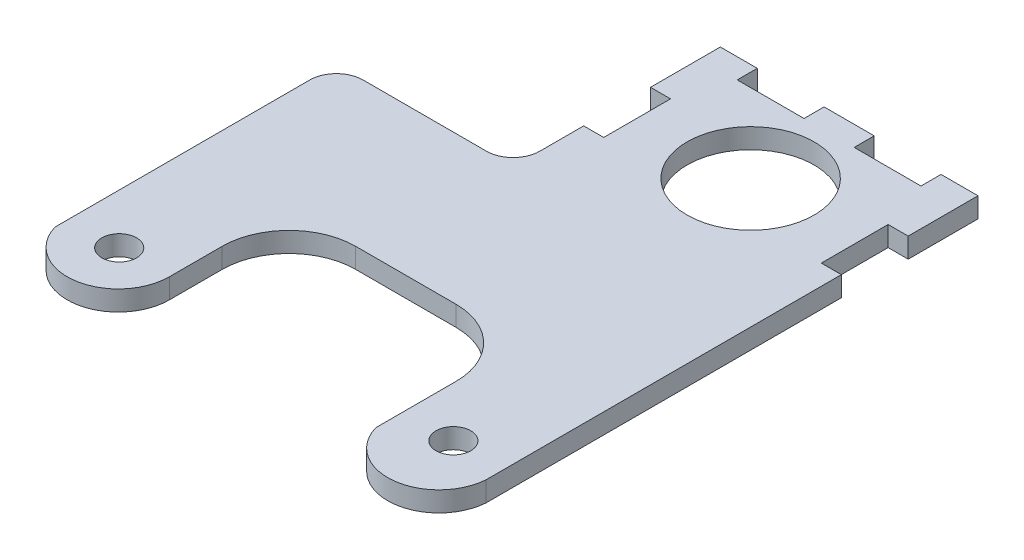
ISO-10303-21;
HEADER;
FILE_DESCRIPTION(('STEP AP214'),'2;1');
FILE_NAME('part.step','',(''),(''),'','','');
FILE_SCHEMA(('AUTOMOTIVE_DESIGN { 1 0 10303 214 1 1 1 1 }'));
ENDSEC;
DATA;
#1=APPLICATION_CONTEXT('core data for automotive mechanical design processes');
#2=APPLICATION_PROTOCOL_DEFINITION('international standard','automotive_design',2000,#1);
#3=PRODUCT_CONTEXT('',#1,'mechanical');
#4=PRODUCT('Part','Part','',(#3));
#5=PRODUCT_RELATED_PRODUCT_CATEGORY('part','',(#4));
#6=PRODUCT_DEFINITION_FORMATION('','',#4);
#7=PRODUCT_DEFINITION_CONTEXT('part definition',#1,'design');
#8=PRODUCT_DEFINITION('design','',#6,#7);
#9=PRODUCT_DEFINITION_SHAPE('','',#8);
#10=(LENGTH_UNIT() NAMED_UNIT(*) SI_UNIT(.MILLI.,.METRE.));
#11=(NAMED_UNIT(*) PLANE_ANGLE_UNIT() SI_UNIT($,.RADIAN.));
#12=(NAMED_UNIT(*) SI_UNIT($,.STERADIAN.) SOLID_ANGLE_UNIT());
#13=UNCERTAINTY_MEASURE_WITH_UNIT(LENGTH_MEASURE(1.E-05),#10,'distance_accuracy_value','');
#14=(GEOMETRIC_REPRESENTATION_CONTEXT(3) GLOBAL_UNCERTAINTY_ASSIGNED_CONTEXT((#13)) GLOBAL_UNIT_ASSIGNED_CONTEXT((#10,
#11,#12)) REPRESENTATION_CONTEXT('',''));
#15=CARTESIAN_POINT('',(0.,0.,0.));
#16=DIRECTION('',(0.,0.,1.));
#17=DIRECTION('',(1.,0.,0.));
#18=AXIS2_PLACEMENT_3D('',#15,#16,#17);
#19=CARTESIAN_POINT('',(32.5,3.,0.));
#20=DIRECTION('',(-1.,0.,0.));
#21=DIRECTION('',(0.,0.,1.));
#22=AXIS2_PLACEMENT_3D('',#19,#20,#21);
#23=PLANE('',#22);
#24=DIRECTION('',(0.,0.,-1.));
#25=VECTOR('',#24,1.);
#26=CARTESIAN_POINT('',(32.5,0.,0.));
#27=LINE('',#26,#25);
#28=CARTESIAN_POINT('',(32.5,0.,34.9170982884143));
#29=VERTEX_POINT('',#28);
#30=CARTESIAN_POINT('',(32.5,0.,-18.2206257203415));
#31=VERTEX_POINT('',#30);
#32=EDGE_CURVE('E270',#29,#31,#27,.T.);
#33=ORIENTED_EDGE('',*,*,#32,.T.);
#34=DIRECTION('',(0.,1.,0.));
#35=VECTOR('',#34,1.);
#36=CARTESIAN_POINT('',(32.5,0.,-18.2206257203415));
#37=LINE('',#36,#35);
#38=CARTESIAN_POINT('',(32.5,3.,-18.2206257203415));
#39=VERTEX_POINT('',#38);
#40=EDGE_CURVE('E542',#31,#39,#37,.T.);
#41=ORIENTED_EDGE('',*,*,#40,.T.);
#42=DIRECTION('',(0.,0.,-1.));
#43=VECTOR('',#42,1.);
#44=CARTESIAN_POINT('',(32.5,3.,0.));
#45=LINE('',#44,#43);
#46=CARTESIAN_POINT('',(32.5,3.,34.9170982884143));
#47=VERTEX_POINT('',#46);
#48=EDGE_CURVE('E447',#47,#39,#45,.T.);
#49=ORIENTED_EDGE('',*,*,#48,.F.);
#50=DIRECTION('',(0.,-1.,0.));
#51=VECTOR('',#50,1.);
#52=CARTESIAN_POINT('',(32.5,3.,34.9170982884143));
#53=LINE('',#52,#51);
#54=EDGE_CURVE('E310',#47,#29,#53,.T.);
#55=ORIENTED_EDGE('',*,*,#54,.T.);
#56=EDGE_LOOP('',(#33,#41,#49,#55));
#57=FACE_BOUND('',#56,.T.);
#58=ADVANCED_FACE('F41',(#57),#23,.F.);
#59=CARTESIAN_POINT('',(-4.57649061620145E-12,3.,-38.6680841648914));
#60=DIRECTION('',(-1.1835317717542E-13,0.,-1.));
#61=DIRECTION('',(-1.,0.,1.1835317717542E-13));
#62=AXIS2_PLACEMENT_3D('',#59,#60,#61);
#63=PLANE('',#62);
#64=DIRECTION('',(0.,1.,0.));
#65=VECTOR('',#64,1.);
#66=CARTESIAN_POINT('',(26.9706856458377,0.,-38.6680841648953));
#67=LINE('',#66,#65);
#68=CARTESIAN_POINT('',(26.9706856458377,0.,-38.6680841648953));
#69=VERTEX_POINT('',#68);
#70=CARTESIAN_POINT('',(26.9706856458377,3.,-38.6680841648953));
#71=VERTEX_POINT('',#70);
#72=EDGE_CURVE('E516',#69,#71,#67,.T.);
#73=ORIENTED_EDGE('',*,*,#72,.T.);
#74=DIRECTION('',(1.,0.,-1.1835317717542E-13));
#75=VECTOR('',#74,1.);
#76=CARTESIAN_POINT('',(-4.57649061620145E-12,3.,-38.6680841648914));
#77=LINE('',#76,#75);
#78=CARTESIAN_POINT('',(32.5,3.,-38.6680841648953));
#79=VERTEX_POINT('',#78);
#80=EDGE_CURVE('E451',#71,#79,#77,.T.);
#81=ORIENTED_EDGE('',*,*,#80,.T.);
#82=DIRECTION('',(0.,-1.,0.));
#83=VECTOR('',#82,1.);
#84=CARTESIAN_POINT('',(32.5,3.,-38.6680841648953));
#85=LINE('',#84,#83);
#86=CARTESIAN_POINT('',(32.5,0.,-38.6680841648953));
#87=VERTEX_POINT('',#86);
#88=EDGE_CURVE('E307',#79,#87,#85,.T.);
#89=ORIENTED_EDGE('',*,*,#88,.T.);
#90=DIRECTION('',(1.,0.,-1.1835317717542E-13));
#91=VECTOR('',#90,1.);
#92=CARTESIAN_POINT('',(-4.57649061620145E-12,0.,-38.6680841648914));
#93=LINE('',#92,#91);
#94=EDGE_CURVE('E267',#69,#87,#93,.T.);
#95=ORIENTED_EDGE('',*,*,#94,.F.);
#96=EDGE_LOOP('',(#73,#81,#89,#95));
#97=FACE_BOUND('',#96,.T.);
#98=ADVANCED_FACE('F584',(#97),#63,.T.);
#99=DIRECTION('',(0.,1.,0.));
#100=VECTOR('',#99,1.);
#101=CARTESIAN_POINT('',(-0.529314354162263,0.,-38.6680841648953));
#102=LINE('',#101,#100);
#103=CARTESIAN_POINT('',(-0.529314354162263,0.,-38.6680841648953));
#104=VERTEX_POINT('',#103);
#105=CARTESIAN_POINT('',(-0.529314354162263,3.,-38.6680841648953));
#106=VERTEX_POINT('',#105);
#107=EDGE_CURVE('E469',#104,#106,#102,.T.);
#108=ORIENTED_EDGE('',*,*,#107,.F.);
#109=CARTESIAN_POINT('',(-6.05862870832456,0.,-38.6680841648953));
#110=VERTEX_POINT('',#109);
#111=EDGE_CURVE('E281',#110,#104,#93,.T.);
#112=ORIENTED_EDGE('',*,*,#111,.F.);
#113=DIRECTION('',(0.,-1.,0.));
#114=VECTOR('',#113,1.);
#115=CARTESIAN_POINT('',(-6.05862870832456,3.,-38.6680841648953));
#116=LINE('',#115,#114);
#117=CARTESIAN_POINT('',(-6.05862870832456,3.,-38.6680841648953));
#118=VERTEX_POINT('',#117);
#119=EDGE_CURVE('E304',#118,#110,#116,.T.);
#120=ORIENTED_EDGE('',*,*,#119,.F.);
#121=EDGE_CURVE('E452',#118,#106,#77,.T.);
#122=ORIENTED_EDGE('',*,*,#121,.T.);
#123=EDGE_LOOP('',(#108,#112,#120,#122));
#124=FACE_BOUND('',#123,.T.);
#125=ADVANCED_FACE('F590',(#124),#63,.T.);
#126=CARTESIAN_POINT('',(-6.05862870832456,3.,0.));
#127=DIRECTION('',(1.,0.,0.));
#128=DIRECTION('',(0.,0.,-1.));
#129=AXIS2_PLACEMENT_3D('',#126,#127,#128);
#130=PLANE('',#129);
#131=DIRECTION('',(0.,0.,1.));
#132=VECTOR('',#131,1.);
#133=CARTESIAN_POINT('',(-6.05862870832456,0.,0.));
#134=LINE('',#133,#132);
#135=CARTESIAN_POINT('',(-6.05862870832456,0.,-28.2206257203415));
#136=VERTEX_POINT('',#135);
#137=EDGE_CURVE('E287',#110,#136,#134,.T.);
#138=ORIENTED_EDGE('',*,*,#137,.T.);
#139=DIRECTION('',(0.,1.,0.));
#140=VECTOR('',#139,1.);
#141=CARTESIAN_POINT('',(-6.05862870832456,0.,-28.2206257203415));
#142=LINE('',#141,#140);
#143=CARTESIAN_POINT('',(-6.05862870832456,3.,-28.2206257203415));
#144=VERTEX_POINT('',#143);
#145=EDGE_CURVE('E861',#136,#144,#142,.T.);
#146=ORIENTED_EDGE('',*,*,#145,.T.);
#147=DIRECTION('',(0.,0.,1.));
#148=VECTOR('',#147,1.);
#149=CARTESIAN_POINT('',(-6.05862870832456,3.,0.));
#150=LINE('',#149,#148);
#151=EDGE_CURVE('E458',#118,#144,#150,.T.);
#152=ORIENTED_EDGE('',*,*,#151,.F.);
#153=ORIENTED_EDGE('',*,*,#119,.T.);
#154=EDGE_LOOP('',(#138,#146,#152,#153));
#155=FACE_BOUND('',#154,.T.);
#156=ADVANCED_FACE('F622',(#155),#130,.F.);
#157=CARTESIAN_POINT('',(0.,3.,-7.66808416489966));
#158=DIRECTION('',(0.,0.,-1.));
#159=DIRECTION('',(-1.,0.,0.));
#160=AXIS2_PLACEMENT_3D('',#157,#158,#159);
#161=PLANE('',#160);
#162=DIRECTION('',(1.,0.,0.));
#163=VECTOR('',#162,1.);
#164=CARTESIAN_POINT('',(0.,0.,-7.66808416489966));
#165=LINE('',#164,#163);
#166=CARTESIAN_POINT('',(-28.5,0.,-7.66808416489966));
#167=VERTEX_POINT('',#166);
#168=CARTESIAN_POINT('',(-10.0586287083246,0.,-7.66808416489966));
#169=VERTEX_POINT('',#168);
#170=EDGE_CURVE('E355',#167,#169,#165,.T.);
#171=ORIENTED_EDGE('',*,*,#170,.F.);
#172=DIRECTION('',(0.,-1.,0.));
#173=VECTOR('',#172,1.);
#174=CARTESIAN_POINT('',(-28.5,3.,-7.66808416489966));
#175=LINE('',#174,#173);
#176=CARTESIAN_POINT('',(-28.5,3.,-7.66808416489966));
#177=VERTEX_POINT('',#176);
#178=EDGE_CURVE('E11',#177,#167,#175,.T.);
#179=ORIENTED_EDGE('',*,*,#178,.F.);
#180=DIRECTION('',(1.,0.,0.));
#181=VECTOR('',#180,1.);
#182=CARTESIAN_POINT('',(0.,3.,-7.66808416489966));
#183=LINE('',#182,#181);
#184=CARTESIAN_POINT('',(-10.0586287083246,3.,-7.66808416489966));
#185=VERTEX_POINT('',#184);
#186=EDGE_CURVE('E426',#177,#185,#183,.T.);
#187=ORIENTED_EDGE('',*,*,#186,.T.);
#188=DIRECTION('',(0.,-1.,0.));
#189=VECTOR('',#188,1.);
#190=CARTESIAN_POINT('',(-10.0586287083246,3.,-7.66808416489966));
#191=LINE('',#190,#189);
#192=EDGE_CURVE('E296',#185,#169,#191,.T.);
#193=ORIENTED_EDGE('',*,*,#192,.T.);
#194=EDGE_LOOP('',(#171,#179,#187,#193));
#195=FACE_BOUND('',#194,.T.);
#196=ADVANCED_FACE('F480',(#195),#161,.T.);
#197=CARTESIAN_POINT('',(-28.5,3.,-3.66808416489966));
#198=DIRECTION('',(0.,-1.,0.));
#199=DIRECTION('',(0.,0.,-1.));
#200=AXIS2_PLACEMENT_3D('',#197,#198,#199);
#201=CYLINDRICAL_SURFACE('',#200,4.);
#202=CARTESIAN_POINT('',(-28.5,0.,-3.66808416489966));
#203=DIRECTION('',(0.,1.,0.));
#204=DIRECTION('',(0.,0.,1.));
#205=AXIS2_PLACEMENT_3D('',#202,#203,#204);
#206=CIRCLE('',#205,4.);
#207=CARTESIAN_POINT('',(-32.5,0.,-3.66808416489966));
#208=VERTEX_POINT('',#207);
#209=EDGE_CURVE('E350',#167,#208,#206,.T.);
#210=ORIENTED_EDGE('',*,*,#209,.T.);
#211=DIRECTION('',(0.,-1.,0.));
#212=VECTOR('',#211,1.);
#213=CARTESIAN_POINT('',(-32.5,3.,-3.66808416489966));
#214=LINE('',#213,#212);
#215=CARTESIAN_POINT('',(-32.5,3.,-3.66808416489966));
#216=VERTEX_POINT('',#215);
#217=EDGE_CURVE('E50',#216,#208,#214,.T.);
#218=ORIENTED_EDGE('',*,*,#217,.F.);
#219=CARTESIAN_POINT('',(-28.5,3.,-3.66808416489966));
#220=DIRECTION('',(0.,1.,0.));
#221=DIRECTION('',(0.,0.,1.));
#222=AXIS2_PLACEMENT_3D('',#219,#220,#221);
#223=CIRCLE('',#222,4.);
#224=EDGE_CURVE('E422',#177,#216,#223,.T.);
#225=ORIENTED_EDGE('',*,*,#224,.F.);
#226=ORIENTED_EDGE('',*,*,#178,.T.);
#227=EDGE_LOOP('',(#210,#218,#225,#226));
#228=FACE_BOUND('',#227,.T.);
#229=ADVANCED_FACE('F351',(#228),#201,.T.);
#230=CARTESIAN_POINT('',(-32.5,3.,0.));
#231=DIRECTION('',(-1.,0.,0.));
#232=DIRECTION('',(0.,0.,1.));
#233=AXIS2_PLACEMENT_3D('',#230,#231,#232);
#234=PLANE('',#233);
#235=DIRECTION('',(0.,0.,-1.));
#236=VECTOR('',#235,1.);
#237=CARTESIAN_POINT('',(-32.5,0.,0.));
#238=LINE('',#237,#236);
#239=CARTESIAN_POINT('',(-32.5,0.,34.4370489288442));
#240=VERTEX_POINT('',#239);
#241=EDGE_CURVE('E344',#240,#208,#238,.T.);
#242=ORIENTED_EDGE('',*,*,#241,.F.);
#243=DIRECTION('',(0.,-1.,0.));
#244=VECTOR('',#243,1.);
#245=CARTESIAN_POINT('',(-32.5,3.,34.4370489288442));
#246=LINE('',#245,#244);
#247=CARTESIAN_POINT('',(-32.5,3.,34.4370489288442));
#248=VERTEX_POINT('',#247);
#249=EDGE_CURVE('E334',#248,#240,#246,.T.);
#250=ORIENTED_EDGE('',*,*,#249,.F.);
#251=DIRECTION('',(0.,0.,-1.));
#252=VECTOR('',#251,1.);
#253=CARTESIAN_POINT('',(-32.5,3.,0.));
#254=LINE('',#253,#252);
#255=EDGE_CURVE('E346',#248,#216,#254,.T.);
#256=ORIENTED_EDGE('',*,*,#255,.T.);
#257=ORIENTED_EDGE('',*,*,#217,.T.);
#258=EDGE_LOOP('',(#242,#250,#256,#257));
#259=FACE_BOUND('',#258,.T.);
#260=ADVANCED_FACE('F342',(#259),#234,.T.);
#261=CARTESIAN_POINT('',(-25.1485271056679,3.,32.3261613705171));
#262=DIRECTION('',(0.,-1.,0.));
#263=DIRECTION('',(0.,0.,-1.));
#264=AXIS2_PLACEMENT_3D('',#261,#262,#263);
#265=CYLINDRICAL_SURFACE('',#264,7.64852927038914);
#266=CARTESIAN_POINT('',(-25.1485271056679,0.,32.3261613705171));
#267=DIRECTION('',(0.,1.,0.));
#268=DIRECTION('',(0.,0.,1.));
#269=AXIS2_PLACEMENT_3D('',#266,#267,#268);
#270=CIRCLE('',#269,7.64852927038914);
#271=CARTESIAN_POINT('',(-17.5,0.,32.3319158351048));
#272=VERTEX_POINT('',#271);
#273=EDGE_CURVE('E359',#240,#272,#270,.T.);
#274=ORIENTED_EDGE('',*,*,#273,.T.);
#275=DIRECTION('',(0.,-1.,0.));
#276=VECTOR('',#275,1.);
#277=CARTESIAN_POINT('',(-17.5,3.,32.3319158351048));
#278=LINE('',#277,#276);
#279=CARTESIAN_POINT('',(-17.5,3.,32.3319158351048));
#280=VERTEX_POINT('',#279);
#281=EDGE_CURVE('E330',#280,#272,#278,.T.);
#282=ORIENTED_EDGE('',*,*,#281,.F.);
#283=CARTESIAN_POINT('',(-25.1485271056679,3.,32.3261613705171));
#284=DIRECTION('',(0.,1.,0.));
#285=DIRECTION('',(0.,0.,1.));
#286=AXIS2_PLACEMENT_3D('',#283,#284,#285);
#287=CIRCLE('',#286,7.64852927038914);
#288=EDGE_CURVE('E414',#248,#280,#287,.T.);
#289=ORIENTED_EDGE('',*,*,#288,.F.);
#290=ORIENTED_EDGE('',*,*,#249,.T.);
#291=EDGE_LOOP('',(#274,#282,#289,#290));
#292=FACE_BOUND('',#291,.T.);
#293=ADVANCED_FACE('F413',(#292),#265,.T.);
#294=CARTESIAN_POINT('',(-17.5,3.,0.));
#295=DIRECTION('',(-1.,0.,0.));
#296=DIRECTION('',(0.,0.,1.));
#297=AXIS2_PLACEMENT_3D('',#294,#295,#296);
#298=PLANE('',#297);
#299=DIRECTION('',(0.,0.,-1.));
#300=VECTOR('',#299,1.);
#301=CARTESIAN_POINT('',(-17.5,0.,0.));
#302=LINE('',#301,#300);
#303=CARTESIAN_POINT('',(-17.5,0.,24.4422316171898));
#304=VERTEX_POINT('',#303);
#305=EDGE_CURVE('E363',#272,#304,#302,.T.);
#306=ORIENTED_EDGE('',*,*,#305,.T.);
#307=DIRECTION('',(0.,-1.,0.));
#308=VECTOR('',#307,1.);
#309=CARTESIAN_POINT('',(-17.5,3.,24.4422316171898));
#310=LINE('',#309,#308);
#311=CARTESIAN_POINT('',(-17.5,3.,24.4422316171898));
#312=VERTEX_POINT('',#311);
#313=EDGE_CURVE('E327',#312,#304,#310,.T.);
#314=ORIENTED_EDGE('',*,*,#313,.F.);
#315=DIRECTION('',(0.,0.,-1.));
#316=VECTOR('',#315,1.);
#317=CARTESIAN_POINT('',(-17.5,3.,0.));
#318=LINE('',#317,#316);
#319=EDGE_CURVE('E409',#280,#312,#318,.T.);
#320=ORIENTED_EDGE('',*,*,#319,.F.);
#321=ORIENTED_EDGE('',*,*,#281,.T.);
#322=EDGE_LOOP('',(#306,#314,#320,#321));
#323=FACE_BOUND('',#322,.T.);
#324=ADVANCED_FACE('F407',(#323),#298,.F.);
#325=CARTESIAN_POINT('',(-7.5,3.,24.4422316171898));
#326=DIRECTION('',(0.,-1.,0.));
#327=DIRECTION('',(0.,0.,-1.));
#328=AXIS2_PLACEMENT_3D('',#325,#326,#327);
#329=CYLINDRICAL_SURFACE('',#328,10.);
#330=CARTESIAN_POINT('',(-7.5,0.,24.4422316171898));
#331=DIRECTION('',(0.,1.,0.));
#332=DIRECTION('',(0.,0.,1.));
#333=AXIS2_PLACEMENT_3D('',#330,#331,#332);
#334=CIRCLE('',#333,10.);
#335=CARTESIAN_POINT('',(-7.5,0.,14.4422316171898));
#336=VERTEX_POINT('',#335);
#337=EDGE_CURVE('E370',#336,#304,#334,.T.);
#338=ORIENTED_EDGE('',*,*,#337,.F.);
#339=DIRECTION('',(0.,-1.,0.));
#340=VECTOR('',#339,1.);
#341=CARTESIAN_POINT('',(-7.5,3.,14.4422316171898));
#342=LINE('',#341,#340);
#343=CARTESIAN_POINT('',(-7.5,3.,14.4422316171898));
#344=VERTEX_POINT('',#343);
#345=EDGE_CURVE('E324',#344,#336,#342,.T.);
#346=ORIENTED_EDGE('',*,*,#345,.F.);
#347=CARTESIAN_POINT('',(-7.5,3.,24.4422316171898));
#348=DIRECTION('',(0.,1.,0.));
#349=DIRECTION('',(0.,0.,1.));
#350=AXIS2_PLACEMENT_3D('',#347,#348,#349);
#351=CIRCLE('',#350,10.);
#352=EDGE_CURVE('E405',#344,#312,#351,.T.);
#353=ORIENTED_EDGE('',*,*,#352,.T.);
#354=ORIENTED_EDGE('',*,*,#313,.T.);
#355=EDGE_LOOP('',(#338,#346,#353,#354));
#356=FACE_BOUND('',#355,.T.);
#357=ADVANCED_FACE('F401',(#356),#329,.F.);
#358=CARTESIAN_POINT('',(0.,3.,14.4422316171898));
#359=DIRECTION('',(0.,0.,-1.));
#360=DIRECTION('',(-1.,0.,0.));
#361=AXIS2_PLACEMENT_3D('',#358,#359,#360);
#362=PLANE('',#361);
#363=DIRECTION('',(1.,0.,0.));
#364=VECTOR('',#363,1.);
#365=CARTESIAN_POINT('',(0.,0.,14.4422316171898));
#366=LINE('',#365,#364);
#367=CARTESIAN_POINT('',(7.50000000000009,0.,14.4422316171898));
#368=VERTEX_POINT('',#367);
#369=EDGE_CURVE('E374',#336,#368,#366,.T.);
#370=ORIENTED_EDGE('',*,*,#369,.T.);
#371=DIRECTION('',(0.,-1.,0.));
#372=VECTOR('',#371,1.);
#373=CARTESIAN_POINT('',(7.50000000000009,3.,14.4422316171898));
#374=LINE('',#373,#372);
#375=CARTESIAN_POINT('',(7.50000000000009,3.,14.4422316171898));
#376=VERTEX_POINT('',#375);
#377=EDGE_CURVE('E321',#376,#368,#374,.T.);
#378=ORIENTED_EDGE('',*,*,#377,.F.);
#379=DIRECTION('',(1.,0.,0.));
#380=VECTOR('',#379,1.);
#381=CARTESIAN_POINT('',(0.,3.,14.4422316171898));
#382=LINE('',#381,#380);
#383=EDGE_CURVE('E434',#344,#376,#382,.T.);
#384=ORIENTED_EDGE('',*,*,#383,.F.);
#385=ORIENTED_EDGE('',*,*,#345,.T.);
#386=EDGE_LOOP('',(#370,#378,#384,#385));
#387=FACE_BOUND('',#386,.T.);
#388=ADVANCED_FACE('F398',(#387),#362,.F.);
#389=CARTESIAN_POINT('',(7.50000000000009,3.,24.4422316171898));
#390=DIRECTION('',(0.,-1.,0.));
#391=DIRECTION('',(0.,0.,-1.));
#392=AXIS2_PLACEMENT_3D('',#389,#390,#391);
#393=CYLINDRICAL_SURFACE('',#392,10.);
#394=CARTESIAN_POINT('',(7.50000000000009,0.,24.4422316171898));
#395=DIRECTION('',(0.,1.,0.));
#396=DIRECTION('',(0.,0.,1.));
#397=AXIS2_PLACEMENT_3D('',#394,#395,#396);
#398=CIRCLE('',#397,10.);
#399=CARTESIAN_POINT('',(17.5000000000001,0.,24.4422316171898));
#400=VERTEX_POINT('',#399);
#401=EDGE_CURVE('E378',#400,#368,#398,.T.);
#402=ORIENTED_EDGE('',*,*,#401,.F.);
#403=DIRECTION('',(0.,-1.,0.));
#404=VECTOR('',#403,1.);
#405=CARTESIAN_POINT('',(17.5000000000001,3.,24.4422316171898));
#406=LINE('',#405,#404);
#407=CARTESIAN_POINT('',(17.5000000000001,3.,24.4422316171898));
#408=VERTEX_POINT('',#407);
#409=EDGE_CURVE('E318',#408,#400,#406,.T.);
#410=ORIENTED_EDGE('',*,*,#409,.F.);
#411=CARTESIAN_POINT('',(7.50000000000009,3.,24.4422316171898));
#412=DIRECTION('',(0.,1.,0.));
#413=DIRECTION('',(0.,0.,1.));
#414=AXIS2_PLACEMENT_3D('',#411,#412,#413);
#415=CIRCLE('',#414,10.);
#416=EDGE_CURVE('E395',#408,#376,#415,.T.);
#417=ORIENTED_EDGE('',*,*,#416,.T.);
#418=ORIENTED_EDGE('',*,*,#377,.T.);
#419=EDGE_LOOP('',(#402,#410,#417,#418));
#420=FACE_BOUND('',#419,.T.);
#421=ADVANCED_FACE('F391',(#420),#393,.F.);
#422=CARTESIAN_POINT('',(17.5000000000001,3.,0.));
#423=DIRECTION('',(1.,0.,0.));
#424=DIRECTION('',(0.,0.,-1.));
#425=AXIS2_PLACEMENT_3D('',#422,#423,#424);
#426=PLANE('',#425);
#427=DIRECTION('',(0.,0.,1.));
#428=VECTOR('',#427,1.);
#429=CARTESIAN_POINT('',(17.5000000000001,0.,0.));
#430=LINE('',#429,#428);
#431=CARTESIAN_POINT('',(17.5000000000001,0.,36.4170982883937));
#432=VERTEX_POINT('',#431);
#433=EDGE_CURVE('E277',#400,#432,#430,.T.);
#434=ORIENTED_EDGE('',*,*,#433,.T.);
#435=DIRECTION('',(0.,-1.,0.));
#436=VECTOR('',#435,1.);
#437=CARTESIAN_POINT('',(17.5000000000001,3.,36.4170982883937));
#438=LINE('',#437,#436);
#439=CARTESIAN_POINT('',(17.5000000000001,3.,36.4170982883937));
#440=VERTEX_POINT('',#439);
#441=EDGE_CURVE('E314',#440,#432,#438,.T.);
#442=ORIENTED_EDGE('',*,*,#441,.F.);
#443=DIRECTION('',(0.,0.,1.));
#444=VECTOR('',#443,1.);
#445=CARTESIAN_POINT('',(17.5000000000001,3.,0.));
#446=LINE('',#445,#444);
#447=EDGE_CURVE('E439',#408,#440,#446,.T.);
#448=ORIENTED_EDGE('',*,*,#447,.F.);
#449=ORIENTED_EDGE('',*,*,#409,.T.);
#450=EDGE_LOOP('',(#434,#442,#448,#449));
#451=FACE_BOUND('',#450,.T.);
#452=ADVANCED_FACE('F386',(#451),#426,.F.);
#453=CARTESIAN_POINT('',(24.8707408773363,3.,34.3745070617492));
#454=DIRECTION('',(0.,-1.,0.));
#455=DIRECTION('',(0.,0.,-1.));
#456=AXIS2_PLACEMENT_3D('',#453,#454,#455);
#457=CYLINDRICAL_SURFACE('',#456,7.64852927038921);
#458=CARTESIAN_POINT('',(24.8707408773363,0.,34.3745070617492));
#459=DIRECTION('',(0.,1.,0.));
#460=DIRECTION('',(0.,0.,1.));
#461=AXIS2_PLACEMENT_3D('',#458,#459,#460);
#462=CIRCLE('',#461,7.64852927038921);
#463=EDGE_CURVE('E271',#432,#29,#462,.T.);
#464=ORIENTED_EDGE('',*,*,#463,.T.);
#465=ORIENTED_EDGE('',*,*,#54,.F.);
#466=CARTESIAN_POINT('',(24.8707408773363,3.,34.3745070617492));
#467=DIRECTION('',(0.,1.,0.));
#468=DIRECTION('',(0.,0.,1.));
#469=AXIS2_PLACEMENT_3D('',#466,#467,#468);
#470=CIRCLE('',#469,7.64852927038921);
#471=EDGE_CURVE('E443',#440,#47,#470,.T.);
#472=ORIENTED_EDGE('',*,*,#471,.F.);
#473=ORIENTED_EDGE('',*,*,#441,.T.);
#474=EDGE_LOOP('',(#464,#465,#472,#473));
#475=FACE_BOUND('',#474,.T.);
#476=ADVANCED_FACE('F595',(#475),#457,.T.);
#477=CARTESIAN_POINT('',(32.5,3.,-28.2206257203415));
#478=VERTEX_POINT('',#477);
#479=EDGE_CURVE('E259',#478,#79,#45,.T.);
#480=ORIENTED_EDGE('',*,*,#479,.F.);
#481=DIRECTION('',(0.,1.,0.));
#482=VECTOR('',#481,1.);
#483=CARTESIAN_POINT('',(32.5,0.,-28.2206257203415));
#484=LINE('',#483,#482);
#485=CARTESIAN_POINT('',(32.5,0.,-28.2206257203415));
#486=VERTEX_POINT('',#485);
#487=EDGE_CURVE('E242',#486,#478,#484,.T.);
#488=ORIENTED_EDGE('',*,*,#487,.F.);
#489=EDGE_CURVE('E256',#486,#87,#27,.T.);
#490=ORIENTED_EDGE('',*,*,#489,.T.);
#491=ORIENTED_EDGE('',*,*,#88,.F.);
#492=EDGE_LOOP('',(#480,#488,#490,#491));
#493=FACE_BOUND('',#492,.T.);
#494=ADVANCED_FACE('F254',(#493),#23,.F.);
#495=DIRECTION('',(0.,1.,0.));
#496=VECTOR('',#495,1.);
#497=CARTESIAN_POINT('',(16.9706856458377,0.,-38.6680841648953));
#498=LINE('',#497,#496);
#499=CARTESIAN_POINT('',(16.9706856458377,0.,-38.6680841648953));
#500=VERTEX_POINT('',#499);
#501=CARTESIAN_POINT('',(16.9706856458377,3.,-38.6680841648953));
#502=VERTEX_POINT('',#501);
#503=EDGE_CURVE('E510',#500,#502,#498,.T.);
#504=ORIENTED_EDGE('',*,*,#503,.F.);
#505=CARTESIAN_POINT('',(9.47068564583774,0.,-38.6680841648953));
#506=VERTEX_POINT('',#505);
#507=EDGE_CURVE('E286',#506,#500,#93,.T.);
#508=ORIENTED_EDGE('',*,*,#507,.F.);
#509=DIRECTION('',(0.,1.,0.));
#510=VECTOR('',#509,1.);
#511=CARTESIAN_POINT('',(9.47068564583774,0.,-38.6680841648953));
#512=LINE('',#511,#510);
#513=CARTESIAN_POINT('',(9.47068564583774,3.,-38.6680841648953));
#514=VERTEX_POINT('',#513);
#515=EDGE_CURVE('E508',#506,#514,#512,.T.);
#516=ORIENTED_EDGE('',*,*,#515,.T.);
#517=EDGE_CURVE('E457',#514,#502,#77,.T.);
#518=ORIENTED_EDGE('',*,*,#517,.T.);
#519=EDGE_LOOP('',(#504,#508,#516,#518));
#520=FACE_BOUND('',#519,.T.);
#521=ADVANCED_FACE('F506',(#520),#63,.T.);
#522=CARTESIAN_POINT('',(-6.05862870832456,3.,-18.2206257203415));
#523=VERTEX_POINT('',#522);
#524=CARTESIAN_POINT('',(-6.05862870832456,3.,-11.6680841648997));
#525=VERTEX_POINT('',#524);
#526=EDGE_CURVE('E456',#523,#525,#150,.T.);
#527=ORIENTED_EDGE('',*,*,#526,.F.);
#528=DIRECTION('',(0.,1.,0.));
#529=VECTOR('',#528,1.);
#530=CARTESIAN_POINT('',(-6.05862870832456,0.,-18.2206257203415));
#531=LINE('',#530,#529);
#532=CARTESIAN_POINT('',(-6.05862870832456,0.,-18.2206257203415));
#533=VERTEX_POINT('',#532);
#534=EDGE_CURVE('E491',#533,#523,#531,.T.);
#535=ORIENTED_EDGE('',*,*,#534,.F.);
#536=CARTESIAN_POINT('',(-6.05862870832456,0.,-11.6680841648997));
#537=VERTEX_POINT('',#536);
#538=EDGE_CURVE('E285',#533,#537,#134,.T.);
#539=ORIENTED_EDGE('',*,*,#538,.T.);
#540=DIRECTION('',(0.,-1.,0.));
#541=VECTOR('',#540,1.);
#542=CARTESIAN_POINT('',(-6.05862870832456,3.,-11.6680841648997));
#543=LINE('',#542,#541);
#544=EDGE_CURVE('E299',#525,#537,#543,.T.);
#545=ORIENTED_EDGE('',*,*,#544,.F.);
#546=EDGE_LOOP('',(#527,#535,#539,#545));
#547=FACE_BOUND('',#546,.T.);
#548=ADVANCED_FACE('F489',(#547),#130,.F.);
#549=CARTESIAN_POINT('',(13.2458231360862,3.,-23.897996209383));
#550=DIRECTION('',(0.,-1.,0.));
#551=DIRECTION('',(0.,0.,-1.));
#552=AXIS2_PLACEMENT_3D('',#549,#550,#551);
#553=CYLINDRICAL_SURFACE('',#552,9.5);
#554=CARTESIAN_POINT('',(13.2458231360862,3.,-23.897996209383));
#555=DIRECTION('',(0.,1.,0.));
#556=DIRECTION('',(0.,0.,1.));
#557=AXIS2_PLACEMENT_3D('',#554,#555,#556);
#558=CIRCLE('',#557,9.5);
#559=CARTESIAN_POINT('',(13.2458231360862,3.,-14.397996209383));
#560=VERTEX_POINT('',#559);
#561=EDGE_CURVE('E564',#560,#560,#558,.T.);
#562=ORIENTED_EDGE('',*,*,#561,.T.);
#563=EDGE_LOOP('',(#562));
#564=FACE_BOUND('',#563,.T.);
#565=CARTESIAN_POINT('',(13.2458231360862,0.,-23.897996209383));
#566=DIRECTION('',(0.,1.,0.));
#567=DIRECTION('',(0.,0.,1.));
#568=AXIS2_PLACEMENT_3D('',#565,#566,#567);
#569=CIRCLE('',#568,9.5);
#570=CARTESIAN_POINT('',(13.2458231360862,0.,-14.397996209383));
#571=VERTEX_POINT('',#570);
#572=EDGE_CURVE('E473',#571,#571,#569,.T.);
#573=ORIENTED_EDGE('',*,*,#572,.F.);
#574=EDGE_LOOP('',(#573));
#575=FACE_BOUND('',#574,.T.);
#576=ADVANCED_FACE('F570',(#564,#575),#553,.F.);
#577=CARTESIAN_POINT('',(25.,3.,32.3319158351047));
#578=DIRECTION('',(0.,-1.,0.));
#579=DIRECTION('',(0.,0.,-1.));
#580=AXIS2_PLACEMENT_3D('',#577,#578,#579);
#581=CYLINDRICAL_SURFACE('',#580,2.6);
#582=CARTESIAN_POINT('',(25.,3.,32.3319158351047));
#583=DIRECTION('',(0.,1.,0.));
#584=DIRECTION('',(0.,0.,1.));
#585=AXIS2_PLACEMENT_3D('',#582,#583,#584);
#586=CIRCLE('',#585,2.6);
#587=CARTESIAN_POINT('',(25.,3.,34.9319158351047));
#588=VERTEX_POINT('',#587);
#589=EDGE_CURVE('E560',#588,#588,#586,.T.);
#590=ORIENTED_EDGE('',*,*,#589,.T.);
#591=EDGE_LOOP('',(#590));
#592=FACE_BOUND('',#591,.T.);
#593=CARTESIAN_POINT('',(25.,0.,32.3319158351047));
#594=DIRECTION('',(0.,1.,0.));
#595=DIRECTION('',(0.,0.,1.));
#596=AXIS2_PLACEMENT_3D('',#593,#594,#595);
#597=CIRCLE('',#596,2.6);
#598=CARTESIAN_POINT('',(25.,0.,34.9319158351047));
#599=VERTEX_POINT('',#598);
#600=EDGE_CURVE('E468',#599,#599,#597,.T.);
#601=ORIENTED_EDGE('',*,*,#600,.F.);
#602=EDGE_LOOP('',(#601));
#603=FACE_BOUND('',#602,.T.);
#604=ADVANCED_FACE('F624',(#592,#603),#581,.F.);
#605=CARTESIAN_POINT('',(-25.,3.,32.3319158351047));
#606=DIRECTION('',(0.,-1.,0.));
#607=DIRECTION('',(0.,0.,-1.));
#608=AXIS2_PLACEMENT_3D('',#605,#606,#607);
#609=CYLINDRICAL_SURFACE('',#608,2.6);
#610=CARTESIAN_POINT('',(-25.,3.,32.3319158351047));
#611=DIRECTION('',(0.,1.,0.));
#612=DIRECTION('',(0.,0.,1.));
#613=AXIS2_PLACEMENT_3D('',#610,#611,#612);
#614=CIRCLE('',#613,2.6);
#615=CARTESIAN_POINT('',(-25.,3.,34.9319158351047));
#616=VERTEX_POINT('',#615);
#617=EDGE_CURVE('E295',#616,#616,#614,.T.);
#618=ORIENTED_EDGE('',*,*,#617,.T.);
#619=EDGE_LOOP('',(#618));
#620=FACE_BOUND('',#619,.T.);
#621=CARTESIAN_POINT('',(-25.,0.,32.3319158351047));
#622=DIRECTION('',(0.,1.,0.));
#623=DIRECTION('',(0.,0.,1.));
#624=AXIS2_PLACEMENT_3D('',#621,#622,#623);
#625=CIRCLE('',#624,2.6);
#626=CARTESIAN_POINT('',(-25.,0.,34.9319158351047));
#627=VERTEX_POINT('',#626);
#628=EDGE_CURVE('E464',#627,#627,#625,.T.);
#629=ORIENTED_EDGE('',*,*,#628,.F.);
#630=EDGE_LOOP('',(#629));
#631=FACE_BOUND('',#630,.T.);
#632=ADVANCED_FACE('F43',(#620,#631),#609,.F.);
#633=CARTESIAN_POINT('',(-10.0586287083246,3.,-11.6680841648997));
#634=DIRECTION('',(0.,-1.,0.));
#635=DIRECTION('',(0.,0.,-1.));
#636=AXIS2_PLACEMENT_3D('',#633,#634,#635);
#637=CYLINDRICAL_SURFACE('',#636,4.);
#638=CARTESIAN_POINT('',(-10.0586287083246,0.,-11.6680841648997));
#639=DIRECTION('',(0.,1.,0.));
#640=DIRECTION('',(0.,0.,1.));
#641=AXIS2_PLACEMENT_3D('',#638,#639,#640);
#642=CIRCLE('',#641,4.);
#643=EDGE_CURVE('E291',#537,#169,#642,.F.);
#644=ORIENTED_EDGE('',*,*,#643,.T.);
#645=ORIENTED_EDGE('',*,*,#192,.F.);
#646=CARTESIAN_POINT('',(-10.0586287083246,3.,-11.6680841648997));
#647=DIRECTION('',(0.,1.,0.));
#648=DIRECTION('',(0.,0.,1.));
#649=AXIS2_PLACEMENT_3D('',#646,#647,#648);
#650=CIRCLE('',#649,4.);
#651=EDGE_CURVE('E300',#525,#185,#650,.F.);
#652=ORIENTED_EDGE('',*,*,#651,.F.);
#653=ORIENTED_EDGE('',*,*,#544,.T.);
#654=EDGE_LOOP('',(#644,#645,#652,#653));
#655=FACE_BOUND('',#654,.T.);
#656=ADVANCED_FACE('F485',(#655),#637,.F.);
#657=CARTESIAN_POINT('',(0.,3.,0.));
#658=DIRECTION('',(0.,1.,0.));
#659=DIRECTION('',(0.,0.,1.));
#660=AXIS2_PLACEMENT_3D('',#657,#658,#659);
#661=PLANE('',#660);
#662=DIRECTION('',(0.,0.,-1.));
#663=VECTOR('',#662,1.);
#664=CARTESIAN_POINT('',(26.9706856458377,3.,-38.6680841648953));
#665=LINE('',#664,#663);
#666=CARTESIAN_POINT('',(26.9706856458377,3.,-35.6680841648953));
#667=VERTEX_POINT('',#666);
#668=EDGE_CURVE('E831',#667,#71,#665,.T.);
#669=ORIENTED_EDGE('',*,*,#668,.F.);
#670=DIRECTION('',(1.,0.,0.));
#671=VECTOR('',#670,1.);
#672=CARTESIAN_POINT('',(26.9706856458377,3.,-35.6680841648953));
#673=LINE('',#672,#671);
#674=CARTESIAN_POINT('',(16.9706856458377,3.,-35.6680841648953));
#675=VERTEX_POINT('',#674);
#676=EDGE_CURVE('E830',#675,#667,#673,.T.);
#677=ORIENTED_EDGE('',*,*,#676,.F.);
#678=DIRECTION('',(0.,0.,1.));
#679=VECTOR('',#678,1.);
#680=CARTESIAN_POINT('',(16.9706856458377,3.,-38.6680841648953));
#681=LINE('',#680,#679);
#682=EDGE_CURVE('E827',#502,#675,#681,.T.);
#683=ORIENTED_EDGE('',*,*,#682,.F.);
#684=ORIENTED_EDGE('',*,*,#517,.F.);
#685=DIRECTION('',(0.,0.,-1.));
#686=VECTOR('',#685,1.);
#687=CARTESIAN_POINT('',(9.47068564583774,3.,-38.6680841648953));
#688=LINE('',#687,#686);
#689=CARTESIAN_POINT('',(9.47068564583774,3.,-35.6680841648953));
#690=VERTEX_POINT('',#689);
#691=EDGE_CURVE('E531',#690,#514,#688,.T.);
#692=ORIENTED_EDGE('',*,*,#691,.F.);
#693=DIRECTION('',(1.,0.,0.));
#694=VECTOR('',#693,1.);
#695=CARTESIAN_POINT('',(-0.529314354162263,3.,-35.6680841648953));
#696=LINE('',#695,#694);
#697=CARTESIAN_POINT('',(-0.529314354162263,3.,-35.6680841648953));
#698=VERTEX_POINT('',#697);
#699=EDGE_CURVE('E541',#698,#690,#696,.T.);
#700=ORIENTED_EDGE('',*,*,#699,.F.);
#701=DIRECTION('',(0.,0.,1.));
#702=VECTOR('',#701,1.);
#703=CARTESIAN_POINT('',(-0.529314354162263,3.,-38.6680841648953));
#704=LINE('',#703,#702);
#705=EDGE_CURVE('E537',#106,#698,#704,.T.);
#706=ORIENTED_EDGE('',*,*,#705,.F.);
#707=ORIENTED_EDGE('',*,*,#121,.F.);
#708=ORIENTED_EDGE('',*,*,#151,.T.);
#709=DIRECTION('',(-1.,0.,0.));
#710=VECTOR('',#709,1.);
#711=CARTESIAN_POINT('',(-6.05862870832456,3.,-28.2206257203415));
#712=LINE('',#711,#710);
#713=CARTESIAN_POINT('',(-3.05862870832456,3.,-28.2206257203415));
#714=VERTEX_POINT('',#713);
#715=EDGE_CURVE('E852',#714,#144,#712,.T.);
#716=ORIENTED_EDGE('',*,*,#715,.F.);
#717=DIRECTION('',(0.,0.,-1.));
#718=VECTOR('',#717,1.);
#719=CARTESIAN_POINT('',(-3.05862870832456,3.,-28.2206257203415));
#720=LINE('',#719,#718);
#721=CARTESIAN_POINT('',(-3.05862870832456,3.,-18.2206257203415));
#722=VERTEX_POINT('',#721);
#723=EDGE_CURVE('E846',#722,#714,#720,.T.);
#724=ORIENTED_EDGE('',*,*,#723,.F.);
#725=DIRECTION('',(1.,0.,0.));
#726=VECTOR('',#725,1.);
#727=CARTESIAN_POINT('',(-6.05862870832456,3.,-18.2206257203415));
#728=LINE('',#727,#726);
#729=EDGE_CURVE('E842',#523,#722,#728,.T.);
#730=ORIENTED_EDGE('',*,*,#729,.F.);
#731=ORIENTED_EDGE('',*,*,#526,.T.);
#732=ORIENTED_EDGE('',*,*,#651,.T.);
#733=ORIENTED_EDGE('',*,*,#186,.F.);
#734=ORIENTED_EDGE('',*,*,#224,.T.);
#735=ORIENTED_EDGE('',*,*,#255,.F.);
#736=ORIENTED_EDGE('',*,*,#288,.T.);
#737=ORIENTED_EDGE('',*,*,#319,.T.);
#738=ORIENTED_EDGE('',*,*,#352,.F.);
#739=ORIENTED_EDGE('',*,*,#383,.T.);
#740=ORIENTED_EDGE('',*,*,#416,.F.);
#741=ORIENTED_EDGE('',*,*,#447,.T.);
#742=ORIENTED_EDGE('',*,*,#471,.T.);
#743=ORIENTED_EDGE('',*,*,#48,.T.);
#744=DIRECTION('',(1.,0.,0.));
#745=VECTOR('',#744,1.);
#746=CARTESIAN_POINT('',(32.5,3.,-18.2206257203415));
#747=LINE('',#746,#745);
#748=CARTESIAN_POINT('',(29.5,3.,-18.2206257203415));
#749=VERTEX_POINT('',#748);
#750=EDGE_CURVE('E250',#749,#39,#747,.T.);
#751=ORIENTED_EDGE('',*,*,#750,.F.);
#752=DIRECTION('',(0.,0.,1.));
#753=VECTOR('',#752,1.);
#754=CARTESIAN_POINT('',(29.5,3.,-18.2206257203415));
#755=LINE('',#754,#753);
#756=CARTESIAN_POINT('',(29.5,3.,-28.2206257203415));
#757=VERTEX_POINT('',#756);
#758=EDGE_CURVE('E898',#757,#749,#755,.T.);
#759=ORIENTED_EDGE('',*,*,#758,.F.);
#760=DIRECTION('',(-1.,0.,0.));
#761=VECTOR('',#760,1.);
#762=CARTESIAN_POINT('',(32.5,3.,-28.2206257203415));
#763=LINE('',#762,#761);
#764=EDGE_CURVE('E865',#478,#757,#763,.T.);
#765=ORIENTED_EDGE('',*,*,#764,.F.);
#766=ORIENTED_EDGE('',*,*,#479,.T.);
#767=ORIENTED_EDGE('',*,*,#80,.F.);
#768=EDGE_LOOP('',(#669,#677,#683,#684,#692,#700,#706,#707,#708,#716,#724,#730,#731,#732,#733,
#734,#735,#736,#737,#738,#739,#740,#741,#742,#743,#751,#759,#765,#766,#767));
#769=FACE_BOUND('',#768,.T.);
#770=ORIENTED_EDGE('',*,*,#617,.F.);
#771=EDGE_LOOP('',(#770));
#772=FACE_BOUND('',#771,.T.);
#773=ORIENTED_EDGE('',*,*,#589,.F.);
#774=EDGE_LOOP('',(#773));
#775=FACE_BOUND('',#774,.T.);
#776=ORIENTED_EDGE('',*,*,#561,.F.);
#777=EDGE_LOOP('',(#776));
#778=FACE_BOUND('',#777,.T.);
#779=ADVANCED_FACE('F419',(#769,#772,#775,#778),#661,.T.);
#780=CARTESIAN_POINT('',(0.,0.,0.));
#781=DIRECTION('',(0.,1.,0.));
#782=DIRECTION('',(0.,0.,1.));
#783=AXIS2_PLACEMENT_3D('',#780,#781,#782);
#784=PLANE('',#783);
#785=DIRECTION('',(1.,0.,0.));
#786=VECTOR('',#785,1.);
#787=CARTESIAN_POINT('',(26.9706856458377,0.,-35.6680841648953));
#788=LINE('',#787,#786);
#789=CARTESIAN_POINT('',(16.9706856458377,0.,-35.6680841648953));
#790=VERTEX_POINT('',#789);
#791=CARTESIAN_POINT('',(26.9706856458377,0.,-35.6680841648953));
#792=VERTEX_POINT('',#791);
#793=EDGE_CURVE('E57',#790,#792,#788,.T.);
#794=ORIENTED_EDGE('',*,*,#793,.T.);
#795=DIRECTION('',(0.,0.,-1.));
#796=VECTOR('',#795,1.);
#797=CARTESIAN_POINT('',(26.9706856458377,0.,-38.6680841648953));
#798=LINE('',#797,#796);
#799=EDGE_CURVE('E836',#792,#69,#798,.T.);
#800=ORIENTED_EDGE('',*,*,#799,.T.);
#801=ORIENTED_EDGE('',*,*,#94,.T.);
#802=ORIENTED_EDGE('',*,*,#489,.F.);
#803=DIRECTION('',(-1.,0.,0.));
#804=VECTOR('',#803,1.);
#805=CARTESIAN_POINT('',(32.5,0.,-28.2206257203415));
#806=LINE('',#805,#804);
#807=CARTESIAN_POINT('',(29.5,0.,-28.2206257203415));
#808=VERTEX_POINT('',#807);
#809=EDGE_CURVE('E238',#486,#808,#806,.T.);
#810=ORIENTED_EDGE('',*,*,#809,.T.);
#811=DIRECTION('',(0.,0.,1.));
#812=VECTOR('',#811,1.);
#813=CARTESIAN_POINT('',(29.5,0.,-18.2206257203415));
#814=LINE('',#813,#812);
#815=CARTESIAN_POINT('',(29.5,0.,-18.2206257203415));
#816=VERTEX_POINT('',#815);
#817=EDGE_CURVE('E249',#808,#816,#814,.T.);
#818=ORIENTED_EDGE('',*,*,#817,.T.);
#819=DIRECTION('',(1.,0.,0.));
#820=VECTOR('',#819,1.);
#821=CARTESIAN_POINT('',(32.5,0.,-18.2206257203415));
#822=LINE('',#821,#820);
#823=EDGE_CURVE('E261',#816,#31,#822,.T.);
#824=ORIENTED_EDGE('',*,*,#823,.T.);
#825=ORIENTED_EDGE('',*,*,#32,.F.);
#826=ORIENTED_EDGE('',*,*,#463,.F.);
#827=ORIENTED_EDGE('',*,*,#433,.F.);
#828=ORIENTED_EDGE('',*,*,#401,.T.);
#829=ORIENTED_EDGE('',*,*,#369,.F.);
#830=ORIENTED_EDGE('',*,*,#337,.T.);
#831=ORIENTED_EDGE('',*,*,#305,.F.);
#832=ORIENTED_EDGE('',*,*,#273,.F.);
#833=ORIENTED_EDGE('',*,*,#241,.T.);
#834=ORIENTED_EDGE('',*,*,#209,.F.);
#835=ORIENTED_EDGE('',*,*,#170,.T.);
#836=ORIENTED_EDGE('',*,*,#643,.F.);
#837=ORIENTED_EDGE('',*,*,#538,.F.);
#838=DIRECTION('',(1.,0.,0.));
#839=VECTOR('',#838,1.);
#840=CARTESIAN_POINT('',(-6.05862870832456,0.,-18.2206257203415));
#841=LINE('',#840,#839);
#842=CARTESIAN_POINT('',(-3.05862870832456,0.,-18.2206257203415));
#843=VERTEX_POINT('',#842);
#844=EDGE_CURVE('E860',#533,#843,#841,.T.);
#845=ORIENTED_EDGE('',*,*,#844,.T.);
#846=DIRECTION('',(0.,0.,-1.));
#847=VECTOR('',#846,1.);
#848=CARTESIAN_POINT('',(-3.05862870832456,0.,-28.2206257203415));
#849=LINE('',#848,#847);
#850=CARTESIAN_POINT('',(-3.05862870832456,0.,-28.2206257203415));
#851=VERTEX_POINT('',#850);
#852=EDGE_CURVE('E65',#843,#851,#849,.T.);
#853=ORIENTED_EDGE('',*,*,#852,.T.);
#854=DIRECTION('',(-1.,0.,0.));
#855=VECTOR('',#854,1.);
#856=CARTESIAN_POINT('',(-6.05862870832456,0.,-28.2206257203415));
#857=LINE('',#856,#855);
#858=EDGE_CURVE('E855',#851,#136,#857,.T.);
#859=ORIENTED_EDGE('',*,*,#858,.T.);
#860=ORIENTED_EDGE('',*,*,#137,.F.);
#861=ORIENTED_EDGE('',*,*,#111,.T.);
#862=DIRECTION('',(0.,0.,1.));
#863=VECTOR('',#862,1.);
#864=CARTESIAN_POINT('',(-0.529314354162263,0.,-38.6680841648953));
#865=LINE('',#864,#863);
#866=CARTESIAN_POINT('',(-0.529314354162263,0.,-35.6680841648953));
#867=VERTEX_POINT('',#866);
#868=EDGE_CURVE('E526',#104,#867,#865,.T.);
#869=ORIENTED_EDGE('',*,*,#868,.T.);
#870=DIRECTION('',(1.,0.,0.));
#871=VECTOR('',#870,1.);
#872=CARTESIAN_POINT('',(-0.529314354162263,0.,-35.6680841648953));
#873=LINE('',#872,#871);
#874=CARTESIAN_POINT('',(9.47068564583774,0.,-35.6680841648953));
#875=VERTEX_POINT('',#874);
#876=EDGE_CURVE('E530',#867,#875,#873,.T.);
#877=ORIENTED_EDGE('',*,*,#876,.T.);
#878=DIRECTION('',(0.,0.,-1.));
#879=VECTOR('',#878,1.);
#880=CARTESIAN_POINT('',(9.47068564583774,0.,-38.6680841648953));
#881=LINE('',#880,#879);
#882=EDGE_CURVE('E502',#875,#506,#881,.T.);
#883=ORIENTED_EDGE('',*,*,#882,.T.);
#884=ORIENTED_EDGE('',*,*,#507,.T.);
#885=DIRECTION('',(0.,0.,1.));
#886=VECTOR('',#885,1.);
#887=CARTESIAN_POINT('',(16.9706856458377,0.,-38.6680841648953));
#888=LINE('',#887,#886);
#889=EDGE_CURVE('E500',#500,#790,#888,.T.);
#890=ORIENTED_EDGE('',*,*,#889,.T.);
#891=EDGE_LOOP('',(#794,#800,#801,#802,#810,#818,#824,#825,#826,#827,#828,#829,#830,#831,#832,
#833,#834,#835,#836,#837,#845,#853,#859,#860,#861,#869,#877,#883,#884,#890));
#892=FACE_BOUND('',#891,.T.);
#893=ORIENTED_EDGE('',*,*,#628,.T.);
#894=EDGE_LOOP('',(#893));
#895=FACE_BOUND('',#894,.T.);
#896=ORIENTED_EDGE('',*,*,#600,.T.);
#897=EDGE_LOOP('',(#896));
#898=FACE_BOUND('',#897,.T.);
#899=ORIENTED_EDGE('',*,*,#572,.T.);
#900=EDGE_LOOP('',(#899));
#901=FACE_BOUND('',#900,.T.);
#902=ADVANCED_FACE('F263',(#892,#895,#898,#901),#784,.F.);
#903=CARTESIAN_POINT('',(-0.529314354162263,0.,-38.6680841648953));
#904=DIRECTION('',(-1.,0.,0.));
#905=DIRECTION('',(0.,0.,1.));
#906=AXIS2_PLACEMENT_3D('',#903,#904,#905);
#907=PLANE('',#906);
#908=ORIENTED_EDGE('',*,*,#705,.T.);
#909=DIRECTION('',(0.,1.,0.));
#910=VECTOR('',#909,1.);
#911=CARTESIAN_POINT('',(-0.529314354162263,0.,-35.6680841648953));
#912=LINE('',#911,#910);
#913=EDGE_CURVE('E536',#867,#698,#912,.T.);
#914=ORIENTED_EDGE('',*,*,#913,.F.);
#915=ORIENTED_EDGE('',*,*,#868,.F.);
#916=ORIENTED_EDGE('',*,*,#107,.T.);
#917=EDGE_LOOP('',(#908,#914,#915,#916));
#918=FACE_BOUND('',#917,.T.);
#919=ADVANCED_FACE('F579',(#918),#907,.F.);
#920=CARTESIAN_POINT('',(9.47068564583774,0.,-38.6680841648953));
#921=DIRECTION('',(1.,0.,0.));
#922=DIRECTION('',(0.,0.,-1.));
#923=AXIS2_PLACEMENT_3D('',#920,#921,#922);
#924=PLANE('',#923);
#925=ORIENTED_EDGE('',*,*,#691,.T.);
#926=ORIENTED_EDGE('',*,*,#515,.F.);
#927=ORIENTED_EDGE('',*,*,#882,.F.);
#928=DIRECTION('',(0.,1.,0.));
#929=VECTOR('',#928,1.);
#930=CARTESIAN_POINT('',(9.47068564583774,0.,-35.6680841648953));
#931=LINE('',#930,#929);
#932=EDGE_CURVE('E552',#875,#690,#931,.T.);
#933=ORIENTED_EDGE('',*,*,#932,.T.);
#934=EDGE_LOOP('',(#925,#926,#927,#933));
#935=FACE_BOUND('',#934,.T.);
#936=ADVANCED_FACE('F719',(#935),#924,.F.);
#937=CARTESIAN_POINT('',(-0.529314354162263,0.,-35.6680841648953));
#938=DIRECTION('',(0.,0.,1.));
#939=DIRECTION('',(1.,0.,0.));
#940=AXIS2_PLACEMENT_3D('',#937,#938,#939);
#941=PLANE('',#940);
#942=ORIENTED_EDGE('',*,*,#699,.T.);
#943=ORIENTED_EDGE('',*,*,#932,.F.);
#944=ORIENTED_EDGE('',*,*,#876,.F.);
#945=ORIENTED_EDGE('',*,*,#913,.T.);
#946=EDGE_LOOP('',(#942,#943,#944,#945));
#947=FACE_BOUND('',#946,.T.);
#948=ADVANCED_FACE('F728',(#947),#941,.F.);
#949=CARTESIAN_POINT('',(32.5,0.,-18.2206257203415));
#950=DIRECTION('',(0.,0.,1.));
#951=DIRECTION('',(1.,0.,0.));
#952=AXIS2_PLACEMENT_3D('',#949,#950,#951);
#953=PLANE('',#952);
#954=ORIENTED_EDGE('',*,*,#750,.T.);
#955=ORIENTED_EDGE('',*,*,#40,.F.);
#956=ORIENTED_EDGE('',*,*,#823,.F.);
#957=DIRECTION('',(0.,1.,0.));
#958=VECTOR('',#957,1.);
#959=CARTESIAN_POINT('',(29.5,0.,-18.2206257203415));
#960=LINE('',#959,#958);
#961=EDGE_CURVE('E890',#816,#749,#960,.T.);
#962=ORIENTED_EDGE('',*,*,#961,.T.);
#963=EDGE_LOOP('',(#954,#955,#956,#962));
#964=FACE_BOUND('',#963,.T.);
#965=ADVANCED_FACE('F738',(#964),#953,.F.);
#966=CARTESIAN_POINT('',(29.5,0.,-18.2206257203415));
#967=DIRECTION('',(-1.,0.,0.));
#968=DIRECTION('',(0.,0.,1.));
#969=AXIS2_PLACEMENT_3D('',#966,#967,#968);
#970=PLANE('',#969);
#971=ORIENTED_EDGE('',*,*,#758,.T.);
#972=ORIENTED_EDGE('',*,*,#961,.F.);
#973=ORIENTED_EDGE('',*,*,#817,.F.);
#974=DIRECTION('',(0.,1.,0.));
#975=VECTOR('',#974,1.);
#976=CARTESIAN_POINT('',(29.5,0.,-28.2206257203415));
#977=LINE('',#976,#975);
#978=EDGE_CURVE('E244',#808,#757,#977,.T.);
#979=ORIENTED_EDGE('',*,*,#978,.T.);
#980=EDGE_LOOP('',(#971,#972,#973,#979));
#981=FACE_BOUND('',#980,.T.);
#982=ADVANCED_FACE('F748',(#981),#970,.F.);
#983=CARTESIAN_POINT('',(32.5,0.,-28.2206257203415));
#984=DIRECTION('',(0.,0.,-1.));
#985=DIRECTION('',(-1.,0.,0.));
#986=AXIS2_PLACEMENT_3D('',#983,#984,#985);
#987=PLANE('',#986);
#988=ORIENTED_EDGE('',*,*,#764,.T.);
#989=ORIENTED_EDGE('',*,*,#978,.F.);
#990=ORIENTED_EDGE('',*,*,#809,.F.);
#991=ORIENTED_EDGE('',*,*,#487,.T.);
#992=EDGE_LOOP('',(#988,#989,#990,#991));
#993=FACE_BOUND('',#992,.T.);
#994=ADVANCED_FACE('F241',(#993),#987,.F.);
#995=CARTESIAN_POINT('',(-6.05862870832456,0.,-28.2206257203415));
#996=DIRECTION('',(0.,0.,-1.));
#997=DIRECTION('',(-1.,0.,0.));
#998=AXIS2_PLACEMENT_3D('',#995,#996,#997);
#999=PLANE('',#998);
#1000=ORIENTED_EDGE('',*,*,#715,.T.);
#1001=ORIENTED_EDGE('',*,*,#145,.F.);
#1002=ORIENTED_EDGE('',*,*,#858,.F.);
#1003=DIRECTION('',(0.,1.,0.));
#1004=VECTOR('',#1003,1.);
#1005=CARTESIAN_POINT('',(-3.05862870832456,0.,-28.2206257203415));
#1006=LINE('',#1005,#1004);
#1007=EDGE_CURVE('E866',#851,#714,#1006,.T.);
#1008=ORIENTED_EDGE('',*,*,#1007,.T.);
#1009=EDGE_LOOP('',(#1000,#1001,#1002,#1008));
#1010=FACE_BOUND('',#1009,.T.);
#1011=ADVANCED_FACE('F767',(#1010),#999,.F.);
#1012=CARTESIAN_POINT('',(-3.05862870832456,0.,-28.2206257203415));
#1013=DIRECTION('',(1.,0.,0.));
#1014=DIRECTION('',(0.,0.,-1.));
#1015=AXIS2_PLACEMENT_3D('',#1012,#1013,#1014);
#1016=PLANE('',#1015);
#1017=ORIENTED_EDGE('',*,*,#723,.T.);
#1018=ORIENTED_EDGE('',*,*,#1007,.F.);
#1019=ORIENTED_EDGE('',*,*,#852,.F.);
#1020=DIRECTION('',(0.,1.,0.));
#1021=VECTOR('',#1020,1.);
#1022=CARTESIAN_POINT('',(-3.05862870832456,0.,-18.2206257203415));
#1023=LINE('',#1022,#1021);
#1024=EDGE_CURVE('E869',#843,#722,#1023,.T.);
#1025=ORIENTED_EDGE('',*,*,#1024,.T.);
#1026=EDGE_LOOP('',(#1017,#1018,#1019,#1025));
#1027=FACE_BOUND('',#1026,.T.);
#1028=ADVANCED_FACE('F776',(#1027),#1016,.F.);
#1029=CARTESIAN_POINT('',(-6.05862870832456,0.,-18.2206257203415));
#1030=DIRECTION('',(0.,0.,1.));
#1031=DIRECTION('',(1.,0.,0.));
#1032=AXIS2_PLACEMENT_3D('',#1029,#1030,#1031);
#1033=PLANE('',#1032);
#1034=ORIENTED_EDGE('',*,*,#729,.T.);
#1035=ORIENTED_EDGE('',*,*,#1024,.F.);
#1036=ORIENTED_EDGE('',*,*,#844,.F.);
#1037=ORIENTED_EDGE('',*,*,#534,.T.);
#1038=EDGE_LOOP('',(#1034,#1035,#1036,#1037));
#1039=FACE_BOUND('',#1038,.T.);
#1040=ADVANCED_FACE('F786',(#1039),#1033,.F.);
#1041=CARTESIAN_POINT('',(26.9706856458377,0.,-38.6680841648953));
#1042=DIRECTION('',(1.,0.,0.));
#1043=DIRECTION('',(0.,0.,-1.));
#1044=AXIS2_PLACEMENT_3D('',#1041,#1042,#1043);
#1045=PLANE('',#1044);
#1046=ORIENTED_EDGE('',*,*,#668,.T.);
#1047=ORIENTED_EDGE('',*,*,#72,.F.);
#1048=ORIENTED_EDGE('',*,*,#799,.F.);
#1049=DIRECTION('',(0.,1.,0.));
#1050=VECTOR('',#1049,1.);
#1051=CARTESIAN_POINT('',(26.9706856458377,0.,-35.6680841648953));
#1052=LINE('',#1051,#1050);
#1053=EDGE_CURVE('E520',#792,#667,#1052,.T.);
#1054=ORIENTED_EDGE('',*,*,#1053,.T.);
#1055=EDGE_LOOP('',(#1046,#1047,#1048,#1054));
#1056=FACE_BOUND('',#1055,.T.);
#1057=ADVANCED_FACE('F795',(#1056),#1045,.F.);
#1058=CARTESIAN_POINT('',(26.9706856458377,0.,-35.6680841648953));
#1059=DIRECTION('',(0.,0.,1.));
#1060=DIRECTION('',(1.,0.,0.));
#1061=AXIS2_PLACEMENT_3D('',#1058,#1059,#1060);
#1062=PLANE('',#1061);
#1063=ORIENTED_EDGE('',*,*,#676,.T.);
#1064=ORIENTED_EDGE('',*,*,#1053,.F.);
#1065=ORIENTED_EDGE('',*,*,#793,.F.);
#1066=DIRECTION('',(0.,1.,0.));
#1067=VECTOR('',#1066,1.);
#1068=CARTESIAN_POINT('',(16.9706856458377,0.,-35.6680841648953));
#1069=LINE('',#1068,#1067);
#1070=EDGE_CURVE('E515',#790,#675,#1069,.T.);
#1071=ORIENTED_EDGE('',*,*,#1070,.T.);
#1072=EDGE_LOOP('',(#1063,#1064,#1065,#1071));
#1073=FACE_BOUND('',#1072,.T.);
#1074=ADVANCED_FACE('F805',(#1073),#1062,.F.);
#1075=CARTESIAN_POINT('',(16.9706856458377,0.,-38.6680841648953));
#1076=DIRECTION('',(-1.,0.,0.));
#1077=DIRECTION('',(0.,0.,1.));
#1078=AXIS2_PLACEMENT_3D('',#1075,#1076,#1077);
#1079=PLANE('',#1078);
#1080=ORIENTED_EDGE('',*,*,#682,.T.);
#1081=ORIENTED_EDGE('',*,*,#1070,.F.);
#1082=ORIENTED_EDGE('',*,*,#889,.F.);
#1083=ORIENTED_EDGE('',*,*,#503,.T.);
#1084=EDGE_LOOP('',(#1080,#1081,#1082,#1083));
#1085=FACE_BOUND('',#1084,.T.);
#1086=ADVANCED_FACE('F815',(#1085),#1079,.F.);
#1087=CLOSED_SHELL('',(#58,#98,#125,#156,#196,#229,#260,#293,#324,#357,#388,#421,#452,#476,#494,
#521,#548,#576,#604,#632,#656,#779,#902,#919,#936,#948,#965,#982,#994,#1011,#1028,#1040,#1057,
#1074,#1086));
#1088=MANIFOLD_SOLID_BREP('B2',#1087);
#1089=ADVANCED_BREP_SHAPE_REPRESENTATION('',(#18,#1088),#14);
#1090=SHAPE_DEFINITION_REPRESENTATION(#9,#1089);
ENDSEC;
END-ISO-10303-21;
